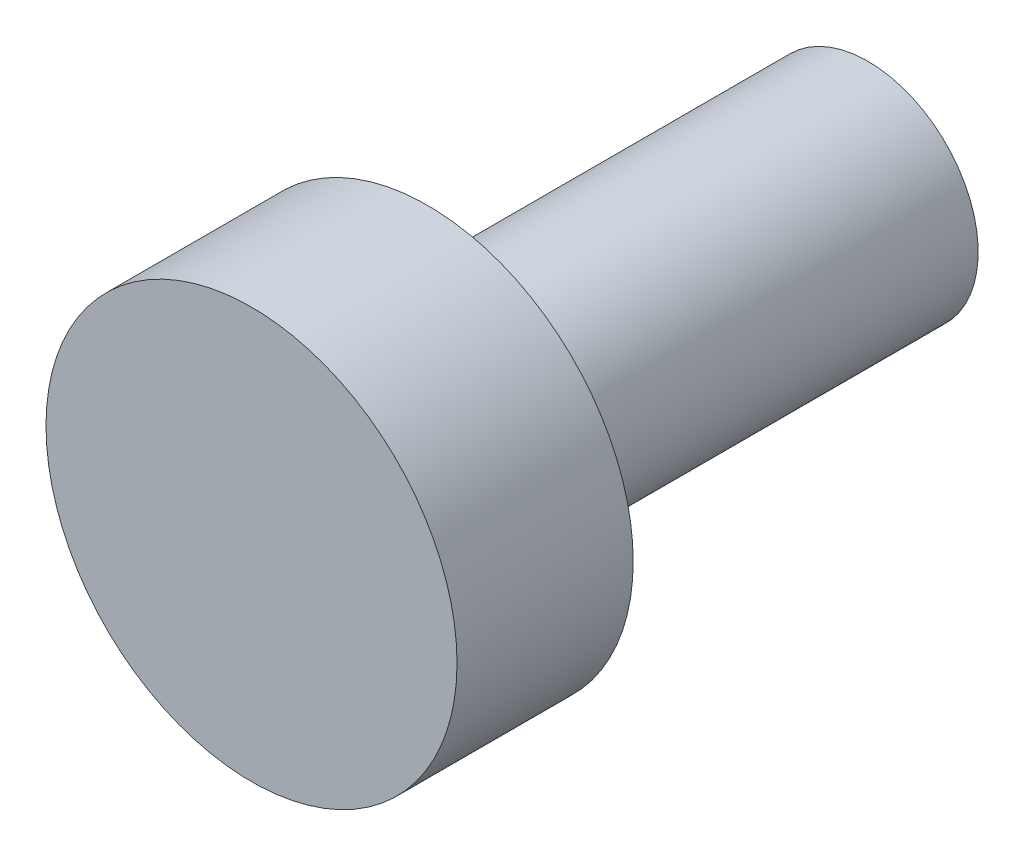
ISO-10303-21;
HEADER;
FILE_DESCRIPTION(('STEP AP214'),'2;1');
FILE_NAME('part.step','',(''),(''),'','','');
FILE_SCHEMA(('AUTOMOTIVE_DESIGN { 1 0 10303 214 1 1 1 1 }'));
ENDSEC;
DATA;
#1=APPLICATION_CONTEXT('core data for automotive mechanical design processes');
#2=APPLICATION_PROTOCOL_DEFINITION('international standard','automotive_design',2000,#1);
#3=PRODUCT_CONTEXT('',#1,'mechanical');
#4=PRODUCT('Part','Part','',(#3));
#5=PRODUCT_RELATED_PRODUCT_CATEGORY('part','',(#4));
#6=PRODUCT_DEFINITION_FORMATION('','',#4);
#7=PRODUCT_DEFINITION_CONTEXT('part definition',#1,'design');
#8=PRODUCT_DEFINITION('design','',#6,#7);
#9=PRODUCT_DEFINITION_SHAPE('','',#8);
#10=(LENGTH_UNIT() NAMED_UNIT(*) SI_UNIT(.MILLI.,.METRE.));
#11=(NAMED_UNIT(*) PLANE_ANGLE_UNIT() SI_UNIT($,.RADIAN.));
#12=(NAMED_UNIT(*) SI_UNIT($,.STERADIAN.) SOLID_ANGLE_UNIT());
#13=UNCERTAINTY_MEASURE_WITH_UNIT(LENGTH_MEASURE(1.E-05),#10,'distance_accuracy_value','');
#14=(GEOMETRIC_REPRESENTATION_CONTEXT(3) GLOBAL_UNCERTAINTY_ASSIGNED_CONTEXT((#13)) GLOBAL_UNIT_ASSIGNED_CONTEXT((#10,
#11,#12)) REPRESENTATION_CONTEXT('',''));
#15=CARTESIAN_POINT('',(0.,0.,0.));
#16=DIRECTION('',(0.,0.,1.));
#17=DIRECTION('',(1.,0.,0.));
#18=AXIS2_PLACEMENT_3D('',#15,#16,#17);
#19=CARTESIAN_POINT('',(0.,0.,2.4));
#20=DIRECTION('',(0.,0.,-1.));
#21=DIRECTION('',(-1.,0.,0.));
#22=AXIS2_PLACEMENT_3D('',#19,#20,#21);
#23=CYLINDRICAL_SURFACE('',#22,2.8);
#24=CARTESIAN_POINT('',(0.,0.,2.4));
#25=DIRECTION('',(0.,0.,1.));
#26=DIRECTION('',(1.,0.,0.));
#27=AXIS2_PLACEMENT_3D('',#24,#25,#26);
#28=CIRCLE('',#27,2.8);
#29=CARTESIAN_POINT('',(2.8,0.,2.4));
#30=VERTEX_POINT('',#29);
#31=EDGE_CURVE('E37',#30,#30,#28,.T.);
#32=ORIENTED_EDGE('',*,*,#31,.F.);
#33=EDGE_LOOP('',(#32));
#34=FACE_BOUND('',#33,.T.);
#35=CARTESIAN_POINT('',(0.,0.,0.));
#36=DIRECTION('',(0.,0.,1.));
#37=DIRECTION('',(1.,0.,0.));
#38=AXIS2_PLACEMENT_3D('',#35,#36,#37);
#39=CIRCLE('',#38,2.8);
#40=CARTESIAN_POINT('',(2.8,0.,0.));
#41=VERTEX_POINT('',#40);
#42=EDGE_CURVE('E33',#41,#41,#39,.T.);
#43=ORIENTED_EDGE('',*,*,#42,.T.);
#44=EDGE_LOOP('',(#43));
#45=FACE_BOUND('',#44,.T.);
#46=ADVANCED_FACE('F30',(#34,#45),#23,.T.);
#47=CARTESIAN_POINT('',(0.,0.,2.4));
#48=DIRECTION('',(0.,0.,1.));
#49=DIRECTION('',(1.,0.,0.));
#50=AXIS2_PLACEMENT_3D('',#47,#48,#49);
#51=PLANE('',#50);
#52=ORIENTED_EDGE('',*,*,#31,.T.);
#53=EDGE_LOOP('',(#52));
#54=FACE_BOUND('',#53,.T.);
#55=ADVANCED_FACE('F54',(#54),#51,.T.);
#56=CARTESIAN_POINT('',(0.,0.,0.));
#57=DIRECTION('',(0.,0.,1.));
#58=DIRECTION('',(1.,0.,0.));
#59=AXIS2_PLACEMENT_3D('',#56,#57,#58);
#60=PLANE('',#59);
#61=CARTESIAN_POINT('',(0.,0.,0.));
#62=DIRECTION('',(0.,0.,-1.));
#63=DIRECTION('',(-1.,0.,0.));
#64=AXIS2_PLACEMENT_3D('',#61,#62,#63);
#65=CIRCLE('',#64,1.5);
#66=CARTESIAN_POINT('',(-1.5,0.,0.));
#67=VERTEX_POINT('',#66);
#68=EDGE_CURVE('E10',#67,#67,#65,.T.);
#69=ORIENTED_EDGE('',*,*,#68,.F.);
#70=EDGE_LOOP('',(#69));
#71=FACE_BOUND('',#70,.T.);
#72=ORIENTED_EDGE('',*,*,#42,.F.);
#73=EDGE_LOOP('',(#72));
#74=FACE_BOUND('',#73,.T.);
#75=ADVANCED_FACE('F51',(#71,#74),#60,.F.);
#76=CARTESIAN_POINT('',(0.,0.,-6.));
#77=DIRECTION('',(0.,0.,1.));
#78=DIRECTION('',(1.,0.,0.));
#79=AXIS2_PLACEMENT_3D('',#76,#77,#78);
#80=CYLINDRICAL_SURFACE('',#79,1.5);
#81=CARTESIAN_POINT('',(0.,0.,-6.));
#82=DIRECTION('',(0.,0.,-1.));
#83=DIRECTION('',(-1.,0.,0.));
#84=AXIS2_PLACEMENT_3D('',#81,#82,#83);
#85=CIRCLE('',#84,1.5);
#86=CARTESIAN_POINT('',(-1.5,0.,-6.));
#87=VERTEX_POINT('',#86);
#88=EDGE_CURVE('E43',#87,#87,#85,.T.);
#89=ORIENTED_EDGE('',*,*,#88,.F.);
#90=EDGE_LOOP('',(#89));
#91=FACE_BOUND('',#90,.T.);
#92=ORIENTED_EDGE('',*,*,#68,.T.);
#93=EDGE_LOOP('',(#92));
#94=FACE_BOUND('',#93,.T.);
#95=ADVANCED_FACE('F53',(#91,#94),#80,.T.);
#96=CARTESIAN_POINT('',(0.,0.,-6.));
#97=DIRECTION('',(0.,0.,-1.));
#98=DIRECTION('',(-1.,0.,0.));
#99=AXIS2_PLACEMENT_3D('',#96,#97,#98);
#100=PLANE('',#99);
#101=ORIENTED_EDGE('',*,*,#88,.T.);
#102=EDGE_LOOP('',(#101));
#103=FACE_BOUND('',#102,.T.);
#104=ADVANCED_FACE('F60',(#103),#100,.T.);
#105=CLOSED_SHELL('',(#46,#55,#75,#95,#104));
#106=MANIFOLD_SOLID_BREP('B2',#105);
#107=ADVANCED_BREP_SHAPE_REPRESENTATION('',(#18,#106),#14);
#108=SHAPE_DEFINITION_REPRESENTATION(#9,#107);
ENDSEC;
END-ISO-10303-21;
